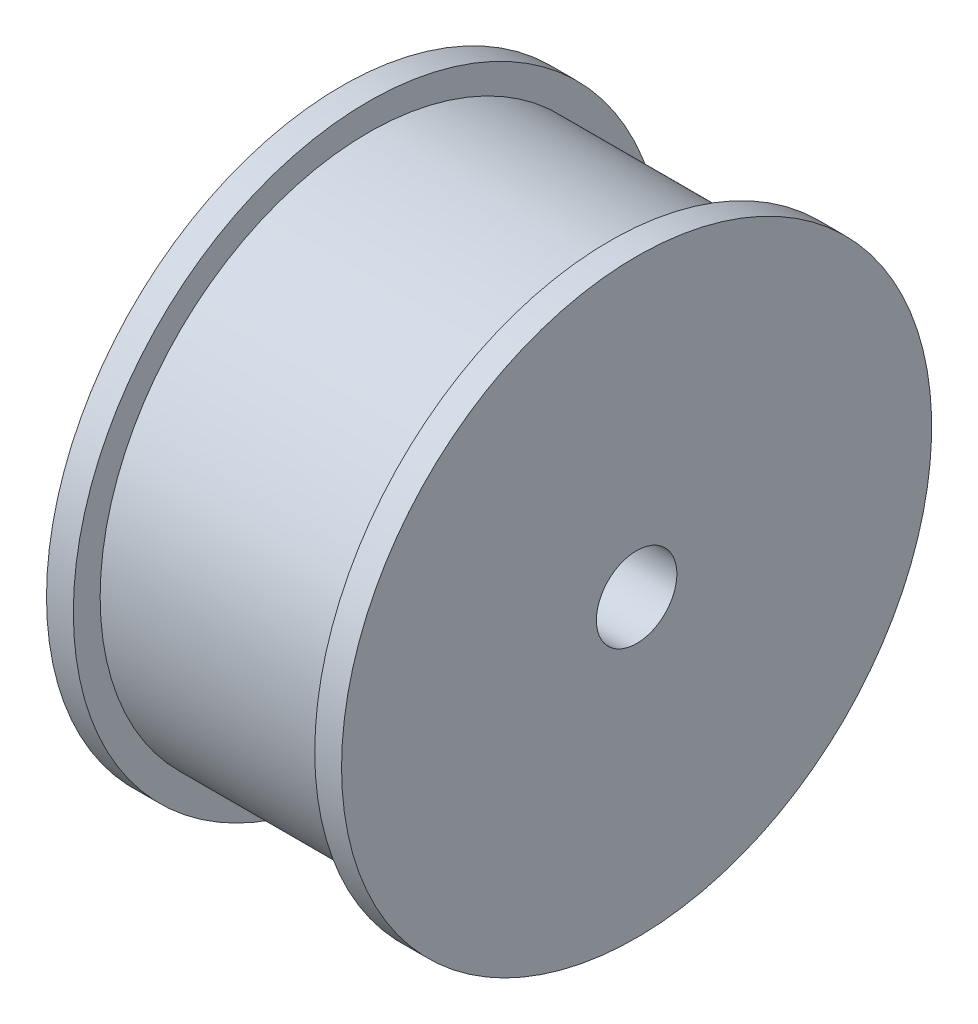
ISO-10303-21;
HEADER;
FILE_DESCRIPTION(('STEP AP214'),'2;1');
FILE_NAME('part.step','',(''),(''),'','','');
FILE_SCHEMA(('AUTOMOTIVE_DESIGN { 1 0 10303 214 1 1 1 1 }'));
ENDSEC;
DATA;
#1=APPLICATION_CONTEXT('core data for automotive mechanical design processes');
#2=APPLICATION_PROTOCOL_DEFINITION('international standard','automotive_design',2000,#1);
#3=PRODUCT_CONTEXT('',#1,'mechanical');
#4=PRODUCT('Part','Part','',(#3));
#5=PRODUCT_RELATED_PRODUCT_CATEGORY('part','',(#4));
#6=PRODUCT_DEFINITION_FORMATION('','',#4);
#7=PRODUCT_DEFINITION_CONTEXT('part definition',#1,'design');
#8=PRODUCT_DEFINITION('design','',#6,#7);
#9=PRODUCT_DEFINITION_SHAPE('','',#8);
#10=(LENGTH_UNIT() NAMED_UNIT(*) SI_UNIT(.MILLI.,.METRE.));
#11=(NAMED_UNIT(*) PLANE_ANGLE_UNIT() SI_UNIT($,.RADIAN.));
#12=(NAMED_UNIT(*) SI_UNIT($,.STERADIAN.) SOLID_ANGLE_UNIT());
#13=UNCERTAINTY_MEASURE_WITH_UNIT(LENGTH_MEASURE(1.E-05),#10,'distance_accuracy_value','');
#14=(GEOMETRIC_REPRESENTATION_CONTEXT(3) GLOBAL_UNCERTAINTY_ASSIGNED_CONTEXT((#13)) GLOBAL_UNIT_ASSIGNED_CONTEXT((#10,
#11,#12)) REPRESENTATION_CONTEXT('',''));
#15=CARTESIAN_POINT('',(0.,0.,0.));
#16=DIRECTION('',(0.,0.,1.));
#17=DIRECTION('',(1.,0.,0.));
#18=AXIS2_PLACEMENT_3D('',#15,#16,#17);
#19=CARTESIAN_POINT('',(0.,0.,0.));
#20=DIRECTION('',(-1.,0.,0.));
#21=DIRECTION('',(0.,0.,1.));
#22=AXIS2_PLACEMENT_3D('',#19,#20,#21);
#23=CYLINDRICAL_SURFACE('',#22,1.5);
#24=CARTESIAN_POINT('',(11.,0.,0.));
#25=DIRECTION('',(-1.,0.,0.));
#26=DIRECTION('',(0.,0.,1.));
#27=AXIS2_PLACEMENT_3D('',#24,#25,#26);
#28=CIRCLE('',#27,1.5);
#29=CARTESIAN_POINT('',(11.,0.,1.5));
#30=VERTEX_POINT('',#29);
#31=EDGE_CURVE('E78',#30,#30,#28,.T.);
#32=ORIENTED_EDGE('',*,*,#31,.F.);
#33=EDGE_LOOP('',(#32));
#34=FACE_BOUND('',#33,.T.);
#35=CARTESIAN_POINT('',(0.,0.,0.));
#36=DIRECTION('',(-1.,0.,0.));
#37=DIRECTION('',(0.,0.,1.));
#38=AXIS2_PLACEMENT_3D('',#35,#36,#37);
#39=CIRCLE('',#38,1.5);
#40=CARTESIAN_POINT('',(0.,0.,1.5));
#41=VERTEX_POINT('',#40);
#42=EDGE_CURVE('E10',#41,#41,#39,.T.);
#43=ORIENTED_EDGE('',*,*,#42,.T.);
#44=EDGE_LOOP('',(#43));
#45=FACE_BOUND('',#44,.T.);
#46=ADVANCED_FACE('F43',(#34,#45),#23,.F.);
#47=CARTESIAN_POINT('',(0.,0.,-1.5));
#48=DIRECTION('',(1.,0.,0.));
#49=DIRECTION('',(0.,0.,-1.));
#50=AXIS2_PLACEMENT_3D('',#47,#48,#49);
#51=PLANE('',#50);
#52=ORIENTED_EDGE('',*,*,#42,.F.);
#53=EDGE_LOOP('',(#52));
#54=FACE_BOUND('',#53,.T.);
#55=CARTESIAN_POINT('',(0.,0.,0.));
#56=DIRECTION('',(-1.,0.,0.));
#57=DIRECTION('',(0.,0.,1.));
#58=AXIS2_PLACEMENT_3D('',#55,#56,#57);
#59=CIRCLE('',#58,11.);
#60=CARTESIAN_POINT('',(0.,0.,11.));
#61=VERTEX_POINT('',#60);
#62=EDGE_CURVE('E50',#61,#61,#59,.T.);
#63=ORIENTED_EDGE('',*,*,#62,.T.);
#64=EDGE_LOOP('',(#63));
#65=FACE_BOUND('',#64,.T.);
#66=ADVANCED_FACE('F86',(#54,#65),#51,.F.);
#67=CARTESIAN_POINT('',(0.,0.,0.));
#68=DIRECTION('',(-1.,0.,0.));
#69=DIRECTION('',(0.,0.,1.));
#70=AXIS2_PLACEMENT_3D('',#67,#68,#69);
#71=CYLINDRICAL_SURFACE('',#70,11.);
#72=ORIENTED_EDGE('',*,*,#62,.F.);
#73=EDGE_LOOP('',(#72));
#74=FACE_BOUND('',#73,.T.);
#75=CARTESIAN_POINT('',(1.,0.,0.));
#76=DIRECTION('',(-1.,0.,0.));
#77=DIRECTION('',(0.,0.,1.));
#78=AXIS2_PLACEMENT_3D('',#75,#76,#77);
#79=CIRCLE('',#78,11.);
#80=CARTESIAN_POINT('',(1.,0.,11.));
#81=VERTEX_POINT('',#80);
#82=EDGE_CURVE('E55',#81,#81,#79,.T.);
#83=ORIENTED_EDGE('',*,*,#82,.T.);
#84=EDGE_LOOP('',(#83));
#85=FACE_BOUND('',#84,.T.);
#86=ADVANCED_FACE('F90',(#74,#85),#71,.T.);
#87=CARTESIAN_POINT('',(1.,0.,-11.));
#88=DIRECTION('',(-1.,0.,0.));
#89=DIRECTION('',(0.,0.,1.));
#90=AXIS2_PLACEMENT_3D('',#87,#88,#89);
#91=PLANE('',#90);
#92=ORIENTED_EDGE('',*,*,#82,.F.);
#93=EDGE_LOOP('',(#92));
#94=FACE_BOUND('',#93,.T.);
#95=CARTESIAN_POINT('',(1.,0.,0.));
#96=DIRECTION('',(-1.,0.,0.));
#97=DIRECTION('',(0.,0.,1.));
#98=AXIS2_PLACEMENT_3D('',#95,#96,#97);
#99=CIRCLE('',#98,10.);
#100=CARTESIAN_POINT('',(1.,0.,10.));
#101=VERTEX_POINT('',#100);
#102=EDGE_CURVE('E60',#101,#101,#99,.T.);
#103=ORIENTED_EDGE('',*,*,#102,.T.);
#104=EDGE_LOOP('',(#103));
#105=FACE_BOUND('',#104,.T.);
#106=ADVANCED_FACE('F95',(#94,#105),#91,.F.);
#107=CARTESIAN_POINT('',(0.,0.,0.));
#108=DIRECTION('',(-1.,0.,0.));
#109=DIRECTION('',(0.,0.,1.));
#110=AXIS2_PLACEMENT_3D('',#107,#108,#109);
#111=CYLINDRICAL_SURFACE('',#110,10.);
#112=ORIENTED_EDGE('',*,*,#102,.F.);
#113=EDGE_LOOP('',(#112));
#114=FACE_BOUND('',#113,.T.);
#115=CARTESIAN_POINT('',(10.,0.,0.));
#116=DIRECTION('',(-1.,0.,0.));
#117=DIRECTION('',(0.,0.,1.));
#118=AXIS2_PLACEMENT_3D('',#115,#116,#117);
#119=CIRCLE('',#118,10.);
#120=CARTESIAN_POINT('',(10.,0.,10.));
#121=VERTEX_POINT('',#120);
#122=EDGE_CURVE('E66',#121,#121,#119,.T.);
#123=ORIENTED_EDGE('',*,*,#122,.T.);
#124=EDGE_LOOP('',(#123));
#125=FACE_BOUND('',#124,.T.);
#126=ADVANCED_FACE('F101',(#114,#125),#111,.T.);
#127=CARTESIAN_POINT('',(10.,0.,-10.));
#128=DIRECTION('',(1.,0.,0.));
#129=DIRECTION('',(0.,0.,-1.));
#130=AXIS2_PLACEMENT_3D('',#127,#128,#129);
#131=PLANE('',#130);
#132=ORIENTED_EDGE('',*,*,#122,.F.);
#133=EDGE_LOOP('',(#132));
#134=FACE_BOUND('',#133,.T.);
#135=CARTESIAN_POINT('',(10.,0.,0.));
#136=DIRECTION('',(-1.,0.,0.));
#137=DIRECTION('',(0.,0.,1.));
#138=AXIS2_PLACEMENT_3D('',#135,#136,#137);
#139=CIRCLE('',#138,11.);
#140=CARTESIAN_POINT('',(10.,0.,11.));
#141=VERTEX_POINT('',#140);
#142=EDGE_CURVE('E70',#141,#141,#139,.T.);
#143=ORIENTED_EDGE('',*,*,#142,.T.);
#144=EDGE_LOOP('',(#143));
#145=FACE_BOUND('',#144,.T.);
#146=ADVANCED_FACE('F105',(#134,#145),#131,.F.);
#147=CARTESIAN_POINT('',(0.,0.,0.));
#148=DIRECTION('',(-1.,0.,0.));
#149=DIRECTION('',(0.,0.,1.));
#150=AXIS2_PLACEMENT_3D('',#147,#148,#149);
#151=CYLINDRICAL_SURFACE('',#150,11.);
#152=ORIENTED_EDGE('',*,*,#142,.F.);
#153=EDGE_LOOP('',(#152));
#154=FACE_BOUND('',#153,.T.);
#155=CARTESIAN_POINT('',(11.,0.,0.));
#156=DIRECTION('',(-1.,0.,0.));
#157=DIRECTION('',(0.,0.,1.));
#158=AXIS2_PLACEMENT_3D('',#155,#156,#157);
#159=CIRCLE('',#158,11.);
#160=CARTESIAN_POINT('',(11.,0.,11.));
#161=VERTEX_POINT('',#160);
#162=EDGE_CURVE('E74',#161,#161,#159,.T.);
#163=ORIENTED_EDGE('',*,*,#162,.T.);
#164=EDGE_LOOP('',(#163));
#165=FACE_BOUND('',#164,.T.);
#166=ADVANCED_FACE('F109',(#154,#165),#151,.T.);
#167=CARTESIAN_POINT('',(11.,0.,-11.));
#168=DIRECTION('',(-1.,0.,0.));
#169=DIRECTION('',(0.,0.,1.));
#170=AXIS2_PLACEMENT_3D('',#167,#168,#169);
#171=PLANE('',#170);
#172=ORIENTED_EDGE('',*,*,#162,.F.);
#173=EDGE_LOOP('',(#172));
#174=FACE_BOUND('',#173,.T.);
#175=ORIENTED_EDGE('',*,*,#31,.T.);
#176=EDGE_LOOP('',(#175));
#177=FACE_BOUND('',#176,.T.);
#178=ADVANCED_FACE('F83',(#174,#177),#171,.F.);
#179=CLOSED_SHELL('',(#46,#66,#86,#106,#126,#146,#166,#178));
#180=MANIFOLD_SOLID_BREP('B2',#179);
#181=ADVANCED_BREP_SHAPE_REPRESENTATION('',(#18,#180),#14);
#182=SHAPE_DEFINITION_REPRESENTATION(#9,#181);
ENDSEC;
END-ISO-10303-21;
